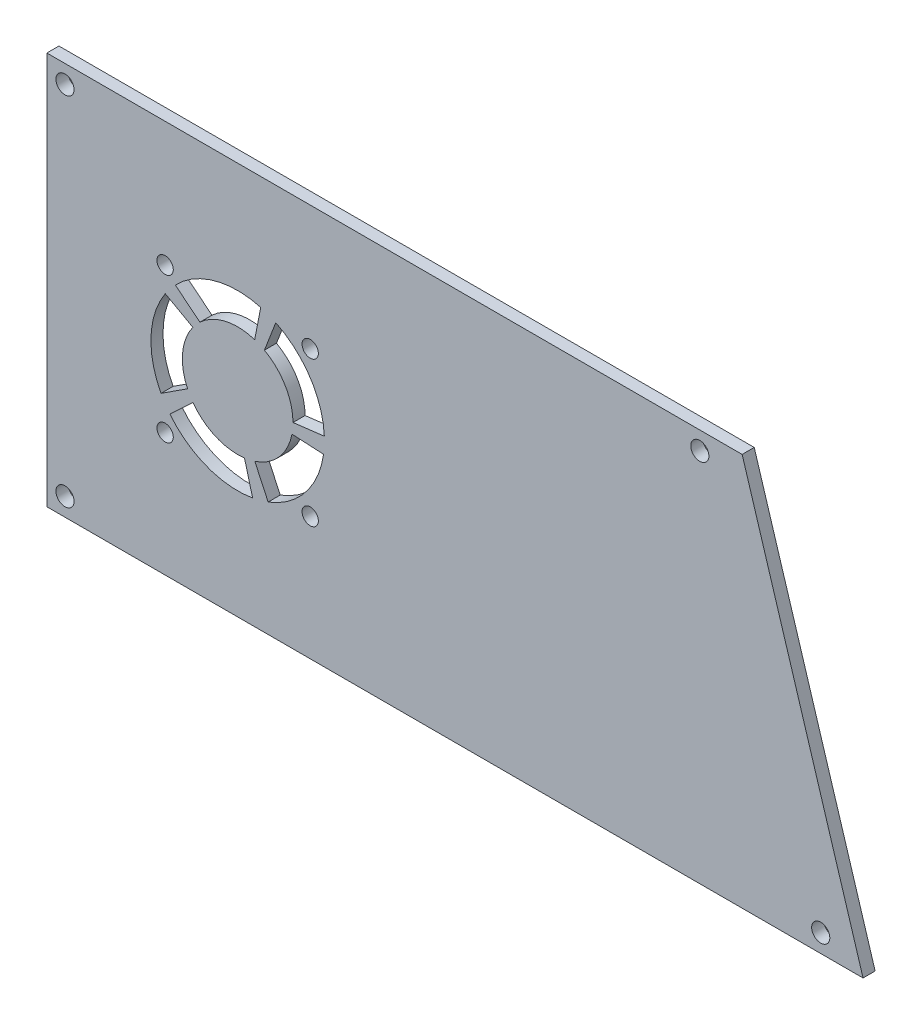
ISO-10303-21;
HEADER;
FILE_DESCRIPTION(('STEP AP214'),'2;1');
FILE_NAME('part.step','',(''),(''),'','','');
FILE_SCHEMA(('AUTOMOTIVE_DESIGN { 1 0 10303 214 1 1 1 1 }'));
ENDSEC;
DATA;
#1=APPLICATION_CONTEXT('core data for automotive mechanical design processes');
#2=APPLICATION_PROTOCOL_DEFINITION('international standard','automotive_design',2000,#1);
#3=PRODUCT_CONTEXT('',#1,'mechanical');
#4=PRODUCT('Part','Part','',(#3));
#5=PRODUCT_RELATED_PRODUCT_CATEGORY('part','',(#4));
#6=PRODUCT_DEFINITION_FORMATION('','',#4);
#7=PRODUCT_DEFINITION_CONTEXT('part definition',#1,'design');
#8=PRODUCT_DEFINITION('design','',#6,#7);
#9=PRODUCT_DEFINITION_SHAPE('','',#8);
#10=(LENGTH_UNIT() NAMED_UNIT(*) SI_UNIT(.MILLI.,.METRE.));
#11=(NAMED_UNIT(*) PLANE_ANGLE_UNIT() SI_UNIT($,.RADIAN.));
#12=(NAMED_UNIT(*) SI_UNIT($,.STERADIAN.) SOLID_ANGLE_UNIT());
#13=UNCERTAINTY_MEASURE_WITH_UNIT(LENGTH_MEASURE(1.E-05),#10,'distance_accuracy_value','');
#14=(GEOMETRIC_REPRESENTATION_CONTEXT(3) GLOBAL_UNCERTAINTY_ASSIGNED_CONTEXT((#13)) GLOBAL_UNIT_ASSIGNED_CONTEXT((#10,
#11,#12)) REPRESENTATION_CONTEXT('',''));
#15=CARTESIAN_POINT('',(0.,0.,0.));
#16=DIRECTION('',(0.,0.,1.));
#17=DIRECTION('',(1.,0.,0.));
#18=AXIS2_PLACEMENT_3D('',#15,#16,#17);
#19=CARTESIAN_POINT('',(-25.9403048802233,-0.089410627221541,2.));
#20=DIRECTION('',(0.,0.,-1.));
#21=DIRECTION('',(-1.,0.,0.));
#22=AXIS2_PLACEMENT_3D('',#19,#20,#21);
#23=CYLINDRICAL_SURFACE('',#22,14.35);
#24=CARTESIAN_POINT('',(-25.9403048802233,-0.089410627221541,2.));
#25=DIRECTION('',(0.,0.,-1.));
#26=DIRECTION('',(-1.,0.,0.));
#27=AXIS2_PLACEMENT_3D('',#24,#25,#26);
#28=CIRCLE('',#27,14.35);
#29=CARTESIAN_POINT('',(-23.4647863790737,-14.224272075091,2.));
#30=VERTEX_POINT('',#29);
#31=CARTESIAN_POINT('',(-37.1593323332284,-9.03680818230524,2.));
#32=VERTEX_POINT('',#31);
#33=EDGE_CURVE('E57',#30,#32,#28,.T.);
#34=ORIENTED_EDGE('',*,*,#33,.F.);
#35=DIRECTION('',(0.,0.,1.));
#36=VECTOR('',#35,1.);
#37=CARTESIAN_POINT('',(-23.4647863790737,-14.224272075091,0.));
#38=LINE('',#37,#36);
#39=CARTESIAN_POINT('',(-23.4647863790737,-14.224272075091,0.));
#40=VERTEX_POINT('',#39);
#41=EDGE_CURVE('E426',#40,#30,#38,.T.);
#42=ORIENTED_EDGE('',*,*,#41,.F.);
#43=CARTESIAN_POINT('',(-25.9403048802233,-0.089410627221541,0.));
#44=DIRECTION('',(0.,0.,-1.));
#45=DIRECTION('',(-1.,0.,0.));
#46=AXIS2_PLACEMENT_3D('',#43,#44,#45);
#47=CIRCLE('',#46,14.35);
#48=CARTESIAN_POINT('',(-37.1593323332284,-9.03680818230524,0.));
#49=VERTEX_POINT('',#48);
#50=EDGE_CURVE('E375',#40,#49,#47,.T.);
#51=ORIENTED_EDGE('',*,*,#50,.T.);
#52=DIRECTION('',(0.,0.,1.));
#53=VECTOR('',#52,1.);
#54=CARTESIAN_POINT('',(-37.1593323332284,-9.03680818230524,0.));
#55=LINE('',#54,#53);
#56=EDGE_CURVE('E256',#49,#32,#55,.T.);
#57=ORIENTED_EDGE('',*,*,#56,.T.);
#58=EDGE_LOOP('',(#34,#42,#51,#57));
#59=FACE_BOUND('',#58,.T.);
#60=ADVANCED_FACE('F39',(#59),#23,.F.);
#61=CARTESIAN_POINT('',(-25.9403048802233,-0.089410627221541,2.));
#62=DIRECTION('',(0.,0.,-1.));
#63=DIRECTION('',(-1.,0.,0.));
#64=AXIS2_PLACEMENT_3D('',#61,#62,#63);
#65=CYLINDRICAL_SURFACE('',#64,9.15);
#66=DIRECTION('',(0.,0.,1.));
#67=VECTOR('',#66,1.);
#68=CARTESIAN_POINT('',(-24.8128992049946,-9.16968906146915,0.));
#69=LINE('',#68,#67);
#70=CARTESIAN_POINT('',(-24.8128992049946,-9.16968906146914,0.));
#71=VERTEX_POINT('',#70);
#72=CARTESIAN_POINT('',(-24.8128992049946,-9.16968906146915,2.));
#73=VERTEX_POINT('',#72);
#74=EDGE_CURVE('E224',#71,#73,#69,.T.);
#75=ORIENTED_EDGE('',*,*,#74,.T.);
#76=CARTESIAN_POINT('',(-25.9403048802233,-0.089410627221541,2.));
#77=DIRECTION('',(0.,0.,-1.));
#78=DIRECTION('',(-1.,0.,0.));
#79=AXIS2_PLACEMENT_3D('',#76,#77,#78);
#80=CIRCLE('',#79,9.15);
#81=CARTESIAN_POINT('',(-33.3348111189585,-5.47863853901995,2.));
#82=VERTEX_POINT('',#81);
#83=EDGE_CURVE('E245',#73,#82,#80,.T.);
#84=ORIENTED_EDGE('',*,*,#83,.T.);
#85=DIRECTION('',(0.,0.,1.));
#86=VECTOR('',#85,1.);
#87=CARTESIAN_POINT('',(-33.3348111189585,-5.47863853901995,0.));
#88=LINE('',#87,#86);
#89=CARTESIAN_POINT('',(-33.3348111189585,-5.47863853901995,0.));
#90=VERTEX_POINT('',#89);
#91=EDGE_CURVE('E271',#90,#82,#88,.T.);
#92=ORIENTED_EDGE('',*,*,#91,.F.);
#93=CARTESIAN_POINT('',(-25.9403048802233,-0.089410627221541,0.));
#94=DIRECTION('',(0.,0.,-1.));
#95=DIRECTION('',(-1.,0.,0.));
#96=AXIS2_PLACEMENT_3D('',#93,#94,#95);
#97=CIRCLE('',#96,9.15);
#98=EDGE_CURVE('E233',#71,#90,#97,.T.);
#99=ORIENTED_EDGE('',*,*,#98,.F.);
#100=EDGE_LOOP('',(#75,#84,#92,#99));
#101=FACE_BOUND('',#100,.T.);
#102=ADVANCED_FACE('F556',(#101),#65,.T.);
#103=CARTESIAN_POINT('',(-11.7322755065531,-2.1029650260209,0.));
#104=VERTEX_POINT('',#103);
#105=CARTESIAN_POINT('',(-20.8976942749154,-13.524237692846,0.));
#106=VERTEX_POINT('',#105);
#107=EDGE_CURVE('E388',#104,#106,#47,.T.);
#108=ORIENTED_EDGE('',*,*,#107,.T.);
#109=DIRECTION('',(0.,0.,1.));
#110=VECTOR('',#109,1.);
#111=CARTESIAN_POINT('',(-20.8976942749154,-13.524237692846,0.));
#112=LINE('',#111,#110);
#113=CARTESIAN_POINT('',(-20.8976942749154,-13.524237692846,2.));
#114=VERTEX_POINT('',#113);
#115=EDGE_CURVE('E65',#106,#114,#112,.T.);
#116=ORIENTED_EDGE('',*,*,#115,.T.);
#117=CARTESIAN_POINT('',(-11.7322755065531,-2.1029650260209,2.));
#118=VERTEX_POINT('',#117);
#119=EDGE_CURVE('E504',#118,#114,#28,.T.);
#120=ORIENTED_EDGE('',*,*,#119,.F.);
#121=DIRECTION('',(0.,0.,1.));
#122=VECTOR('',#121,1.);
#123=CARTESIAN_POINT('',(-11.7322755065531,-2.1029650260209,0.));
#124=LINE('',#123,#122);
#125=EDGE_CURVE('E428',#104,#118,#124,.T.);
#126=ORIENTED_EDGE('',*,*,#125,.F.);
#127=EDGE_LOOP('',(#108,#116,#120,#126));
#128=FACE_BOUND('',#127,.T.);
#129=ADVANCED_FACE('F558',(#128),#23,.F.);
#130=DIRECTION('',(0.,0.,1.));
#131=VECTOR('',#130,1.);
#132=CARTESIAN_POINT('',(-23.0998726496885,-8.78736698166132,0.));
#133=LINE('',#132,#131);
#134=CARTESIAN_POINT('',(-23.0998726496885,-8.78736698166132,0.));
#135=VERTEX_POINT('',#134);
#136=CARTESIAN_POINT('',(-23.0998726496885,-8.78736698166132,2.));
#137=VERTEX_POINT('',#136);
#138=EDGE_CURVE('E207',#135,#137,#133,.T.);
#139=ORIENTED_EDGE('',*,*,#138,.F.);
#140=CARTESIAN_POINT('',(-16.9560593923573,-1.82314446312594,0.));
#141=VERTEX_POINT('',#140);
#142=EDGE_CURVE('E220',#141,#135,#97,.T.);
#143=ORIENTED_EDGE('',*,*,#142,.F.);
#144=DIRECTION('',(0.,0.,1.));
#145=VECTOR('',#144,1.);
#146=CARTESIAN_POINT('',(-16.9560593923573,-1.82314446312594,0.));
#147=LINE('',#146,#145);
#148=CARTESIAN_POINT('',(-16.9560593923573,-1.82314446312594,2.));
#149=VERTEX_POINT('',#148);
#150=EDGE_CURVE('E433',#141,#149,#147,.T.);
#151=ORIENTED_EDGE('',*,*,#150,.T.);
#152=EDGE_CURVE('E222',#149,#137,#80,.T.);
#153=ORIENTED_EDGE('',*,*,#152,.T.);
#154=EDGE_LOOP('',(#139,#143,#151,#153));
#155=FACE_BOUND('',#154,.T.);
#156=ADVANCED_FACE('F218',(#155),#65,.T.);
#157=CARTESIAN_POINT('',(-19.6347783152879,12.801005763993,0.));
#158=VERTEX_POINT('',#157);
#159=CARTESIAN_POINT('',(-11.6047726811072,0.554807168329131,0.));
#160=VERTEX_POINT('',#159);
#161=EDGE_CURVE('E386',#158,#160,#47,.T.);
#162=ORIENTED_EDGE('',*,*,#161,.T.);
#163=DIRECTION('',(0.,0.,1.));
#164=VECTOR('',#163,1.);
#165=CARTESIAN_POINT('',(-11.6047726811072,0.554807168329131,0.));
#166=LINE('',#165,#164);
#167=CARTESIAN_POINT('',(-11.6047726811072,0.554807168329131,2.));
#168=VERTEX_POINT('',#167);
#169=EDGE_CURVE('E397',#160,#168,#166,.T.);
#170=ORIENTED_EDGE('',*,*,#169,.T.);
#171=CARTESIAN_POINT('',(-19.6347783152879,12.801005763993,2.));
#172=VERTEX_POINT('',#171);
#173=EDGE_CURVE('E502',#172,#168,#28,.T.);
#174=ORIENTED_EDGE('',*,*,#173,.F.);
#175=DIRECTION('',(0.,0.,1.));
#176=VECTOR('',#175,1.);
#177=CARTESIAN_POINT('',(-19.6347783152879,12.801005763993,0.));
#178=LINE('',#177,#176);
#179=EDGE_CURVE('E400',#158,#172,#178,.T.);
#180=ORIENTED_EDGE('',*,*,#179,.F.);
#181=EDGE_LOOP('',(#162,#170,#174,#180));
#182=FACE_BOUND('',#181,.T.);
#183=ADVANCED_FACE('F396',(#182),#23,.F.);
#184=DIRECTION('',(0.,0.,1.));
#185=VECTOR('',#184,1.);
#186=CARTESIAN_POINT('',(-16.7903149802769,-0.0758153751301005,0.));
#187=LINE('',#186,#185);
#188=CARTESIAN_POINT('',(-16.7903149802769,-0.0758153751301005,0.));
#189=VERTEX_POINT('',#188);
#190=CARTESIAN_POINT('',(-16.7903149802769,-0.0758153751301005,2.));
#191=VERTEX_POINT('',#190);
#192=EDGE_CURVE('E411',#189,#191,#187,.T.);
#193=ORIENTED_EDGE('',*,*,#192,.F.);
#194=CARTESIAN_POINT('',(-21.5151414806781,7.91936136899142,0.));
#195=VERTEX_POINT('',#194);
#196=EDGE_CURVE('E232',#195,#189,#97,.T.);
#197=ORIENTED_EDGE('',*,*,#196,.F.);
#198=DIRECTION('',(0.,0.,1.));
#199=VECTOR('',#198,1.);
#200=CARTESIAN_POINT('',(-21.5151414806781,7.91936136899143,0.));
#201=LINE('',#200,#199);
#202=CARTESIAN_POINT('',(-21.5151414806781,7.91936136899143,2.));
#203=VERTEX_POINT('',#202);
#204=EDGE_CURVE('E455',#195,#203,#201,.T.);
#205=ORIENTED_EDGE('',*,*,#204,.T.);
#206=EDGE_CURVE('E520',#203,#191,#80,.T.);
#207=ORIENTED_EDGE('',*,*,#206,.T.);
#208=EDGE_LOOP('',(#193,#197,#205,#207));
#209=FACE_BOUND('',#208,.T.);
#210=ADVANCED_FACE('F519',(#209),#65,.T.);
#211=CARTESIAN_POINT('',(-36.2513045197981,9.89085923048711,0.));
#212=VERTEX_POINT('',#211);
#213=CARTESIAN_POINT('',(-22.123069339659,13.7435649322108,0.));
#214=VERTEX_POINT('',#213);
#215=EDGE_CURVE('E380',#212,#214,#47,.T.);
#216=ORIENTED_EDGE('',*,*,#215,.T.);
#217=DIRECTION('',(0.,0.,1.));
#218=VECTOR('',#217,1.);
#219=CARTESIAN_POINT('',(-22.123069339659,13.7435649322108,0.));
#220=LINE('',#219,#218);
#221=CARTESIAN_POINT('',(-22.123069339659,13.7435649322108,2.));
#222=VERTEX_POINT('',#221);
#223=EDGE_CURVE('E445',#214,#222,#220,.T.);
#224=ORIENTED_EDGE('',*,*,#223,.T.);
#225=CARTESIAN_POINT('',(-36.2513045197981,9.89085923048711,2.));
#226=VERTEX_POINT('',#225);
#227=EDGE_CURVE('E499',#226,#222,#28,.T.);
#228=ORIENTED_EDGE('',*,*,#227,.F.);
#229=DIRECTION('',(0.,0.,1.));
#230=VECTOR('',#229,1.);
#231=CARTESIAN_POINT('',(-36.2513045197981,9.89085923048711,0.));
#232=LINE('',#231,#230);
#233=EDGE_CURVE('E239',#212,#226,#232,.T.);
#234=ORIENTED_EDGE('',*,*,#233,.F.);
#235=EDGE_LOOP('',(#216,#224,#228,#234));
#236=FACE_BOUND('',#235,.T.);
#237=ADVANCED_FACE('F566',(#236),#23,.F.);
#238=DIRECTION('',(0.,0.,1.));
#239=VECTOR('',#238,1.);
#240=CARTESIAN_POINT('',(-23.125732355873,8.61694805509637,0.));
#241=LINE('',#240,#239);
#242=CARTESIAN_POINT('',(-23.125732355873,8.61694805509637,0.));
#243=VERTEX_POINT('',#242);
#244=CARTESIAN_POINT('',(-23.125732355873,8.61694805509637,2.));
#245=VERTEX_POINT('',#244);
#246=EDGE_CURVE('E459',#243,#245,#241,.T.);
#247=ORIENTED_EDGE('',*,*,#246,.F.);
#248=CARTESIAN_POINT('',(-32.1896489813983,6.59401651049076,0.));
#249=VERTEX_POINT('',#248);
#250=EDGE_CURVE('E238',#249,#243,#97,.T.);
#251=ORIENTED_EDGE('',*,*,#250,.F.);
#252=DIRECTION('',(0.,0.,1.));
#253=VECTOR('',#252,1.);
#254=CARTESIAN_POINT('',(-32.1896489813983,6.59401651049077,0.));
#255=LINE('',#254,#253);
#256=CARTESIAN_POINT('',(-32.1896489813983,6.59401651049077,2.));
#257=VERTEX_POINT('',#256);
#258=EDGE_CURVE('E481',#249,#257,#255,.T.);
#259=ORIENTED_EDGE('',*,*,#258,.T.);
#260=EDGE_CURVE('E522',#257,#245,#80,.T.);
#261=ORIENTED_EDGE('',*,*,#260,.T.);
#262=EDGE_LOOP('',(#247,#251,#259,#261));
#263=FACE_BOUND('',#262,.T.);
#264=ADVANCED_FACE('F576',(#263),#65,.T.);
#265=CARTESIAN_POINT('',(-57.5,32.5,2.));
#266=DIRECTION('',(0.,-1.,0.));
#267=DIRECTION('',(0.,0.,-1.));
#268=AXIS2_PLACEMENT_3D('',#265,#266,#267);
#269=PLANE('',#268);
#270=DIRECTION('',(-1.,0.,0.));
#271=VECTOR('',#270,1.);
#272=CARTESIAN_POINT('',(-57.5,32.5,0.));
#273=LINE('',#272,#271);
#274=CARTESIAN_POINT('',(57.5,32.5,0.));
#275=VERTEX_POINT('',#274);
#276=CARTESIAN_POINT('',(-57.5,32.5,0.));
#277=VERTEX_POINT('',#276);
#278=EDGE_CURVE('E267',#275,#277,#273,.T.);
#279=ORIENTED_EDGE('',*,*,#278,.T.);
#280=DIRECTION('',(0.,0.,-1.));
#281=VECTOR('',#280,1.);
#282=CARTESIAN_POINT('',(-57.5,32.5,2.));
#283=LINE('',#282,#281);
#284=CARTESIAN_POINT('',(-57.5,32.5,2.));
#285=VERTEX_POINT('',#284);
#286=EDGE_CURVE('E282',#285,#277,#283,.T.);
#287=ORIENTED_EDGE('',*,*,#286,.F.);
#288=DIRECTION('',(-1.,0.,0.));
#289=VECTOR('',#288,1.);
#290=CARTESIAN_POINT('',(-57.5,32.5,2.));
#291=LINE('',#290,#289);
#292=CARTESIAN_POINT('',(57.5,32.5,2.));
#293=VERTEX_POINT('',#292);
#294=EDGE_CURVE('E301',#293,#285,#291,.T.);
#295=ORIENTED_EDGE('',*,*,#294,.F.);
#296=DIRECTION('',(0.,0.,-1.));
#297=VECTOR('',#296,1.);
#298=CARTESIAN_POINT('',(57.5,32.5,2.));
#299=LINE('',#298,#297);
#300=EDGE_CURVE('E277',#293,#275,#299,.T.);
#301=ORIENTED_EDGE('',*,*,#300,.T.);
#302=EDGE_LOOP('',(#279,#287,#295,#301));
#303=FACE_BOUND('',#302,.T.);
#304=ADVANCED_FACE('F582',(#303),#269,.F.);
#305=CARTESIAN_POINT('',(-57.5,-32.5,2.));
#306=DIRECTION('',(1.,0.,0.));
#307=DIRECTION('',(0.,0.,-1.));
#308=AXIS2_PLACEMENT_3D('',#305,#306,#307);
#309=PLANE('',#308);
#310=DIRECTION('',(0.,-1.,0.));
#311=VECTOR('',#310,1.);
#312=CARTESIAN_POINT('',(-57.5,-32.5,0.));
#313=LINE('',#312,#311);
#314=CARTESIAN_POINT('',(-57.5,-32.5,0.));
#315=VERTEX_POINT('',#314);
#316=EDGE_CURVE('E281',#277,#315,#313,.T.);
#317=ORIENTED_EDGE('',*,*,#316,.T.);
#318=DIRECTION('',(0.,0.,-1.));
#319=VECTOR('',#318,1.);
#320=CARTESIAN_POINT('',(-57.5,-32.5,2.));
#321=LINE('',#320,#319);
#322=CARTESIAN_POINT('',(-57.5,-32.5,2.));
#323=VERTEX_POINT('',#322);
#324=EDGE_CURVE('E287',#323,#315,#321,.T.);
#325=ORIENTED_EDGE('',*,*,#324,.F.);
#326=DIRECTION('',(0.,-1.,0.));
#327=VECTOR('',#326,1.);
#328=CARTESIAN_POINT('',(-57.5,-32.5,2.));
#329=LINE('',#328,#327);
#330=EDGE_CURVE('E303',#285,#323,#329,.T.);
#331=ORIENTED_EDGE('',*,*,#330,.F.);
#332=ORIENTED_EDGE('',*,*,#286,.T.);
#333=EDGE_LOOP('',(#317,#325,#331,#332));
#334=FACE_BOUND('',#333,.T.);
#335=ADVANCED_FACE('F643',(#334),#309,.F.);
#336=CARTESIAN_POINT('',(-57.5,-32.5,2.));
#337=DIRECTION('',(0.,1.,0.));
#338=DIRECTION('',(0.,0.,1.));
#339=AXIS2_PLACEMENT_3D('',#336,#337,#338);
#340=PLANE('',#339);
#341=DIRECTION('',(1.,0.,0.));
#342=VECTOR('',#341,1.);
#343=CARTESIAN_POINT('',(-57.5,-32.5,0.));
#344=LINE('',#343,#342);
#345=CARTESIAN_POINT('',(77.5,-32.5,0.));
#346=VERTEX_POINT('',#345);
#347=EDGE_CURVE('E286',#315,#346,#344,.T.);
#348=ORIENTED_EDGE('',*,*,#347,.T.);
#349=DIRECTION('',(0.,0.,-1.));
#350=VECTOR('',#349,1.);
#351=CARTESIAN_POINT('',(77.5,-32.5,2.));
#352=LINE('',#351,#350);
#353=CARTESIAN_POINT('',(77.5,-32.5,2.));
#354=VERTEX_POINT('',#353);
#355=EDGE_CURVE('E309',#354,#346,#352,.T.);
#356=ORIENTED_EDGE('',*,*,#355,.F.);
#357=DIRECTION('',(1.,0.,0.));
#358=VECTOR('',#357,1.);
#359=CARTESIAN_POINT('',(-57.5,-32.5,2.));
#360=LINE('',#359,#358);
#361=EDGE_CURVE('E298',#323,#354,#360,.T.);
#362=ORIENTED_EDGE('',*,*,#361,.F.);
#363=ORIENTED_EDGE('',*,*,#324,.T.);
#364=EDGE_LOOP('',(#348,#356,#362,#363));
#365=FACE_BOUND('',#364,.T.);
#366=ADVANCED_FACE('F637',(#365),#340,.F.);
#367=CARTESIAN_POINT('',(0.,0.,2.));
#368=DIRECTION('',(0.,0.,-1.));
#369=DIRECTION('',(-1.,0.,0.));
#370=AXIS2_PLACEMENT_3D('',#367,#368,#369);
#371=PLANE('',#370);
#372=ORIENTED_EDGE('',*,*,#119,.T.);
#373=DIRECTION('',(-0.421570633889257,0.906795567171681,0.));
#374=VECTOR('',#373,1.);
#375=CARTESIAN_POINT('',(-20.8976942749154,-13.524237692846,2.));
#376=LINE('',#375,#374);
#377=EDGE_CURVE('E621',#114,#137,#376,.T.);
#378=ORIENTED_EDGE('',*,*,#377,.T.);
#379=ORIENTED_EDGE('',*,*,#152,.F.);
#380=DIRECTION('',(0.998568387566009,-0.0534899556348738,0.));
#381=VECTOR('',#380,1.);
#382=CARTESIAN_POINT('',(-11.7322755065531,-2.1029650260209,2.));
#383=LINE('',#382,#381);
#384=EDGE_CURVE('E416',#149,#118,#383,.T.);
#385=ORIENTED_EDGE('',*,*,#384,.T.);
#386=EDGE_LOOP('',(#372,#378,#379,#385));
#387=FACE_BOUND('',#386,.T.);
#388=ORIENTED_EDGE('',*,*,#173,.T.);
#389=DIRECTION('',(-0.992686323307386,-0.12072225775914,0.));
#390=VECTOR('',#389,1.);
#391=CARTESIAN_POINT('',(-11.6047726811072,0.554807168329131,2.));
#392=LINE('',#391,#390);
#393=EDGE_CURVE('E409',#168,#191,#392,.T.);
#394=ORIENTED_EDGE('',*,*,#393,.T.);
#395=ORIENTED_EDGE('',*,*,#206,.F.);
#396=DIRECTION('',(0.359446572666368,0.933165666641461,0.));
#397=VECTOR('',#396,1.);
#398=CARTESIAN_POINT('',(-19.6347783152879,12.801005763993,2.));
#399=LINE('',#398,#397);
#400=EDGE_CURVE('E442',#203,#172,#399,.T.);
#401=ORIENTED_EDGE('',*,*,#400,.T.);
#402=EDGE_LOOP('',(#388,#394,#395,#401));
#403=FACE_BOUND('',#402,.T.);
#404=ORIENTED_EDGE('',*,*,#227,.T.);
#405=DIRECTION('',(-0.191943254081869,-0.981406025665455,0.));
#406=VECTOR('',#405,1.);
#407=CARTESIAN_POINT('',(-22.123069339659,13.7435649322108,2.));
#408=LINE('',#407,#406);
#409=EDGE_CURVE('E432',#222,#245,#408,.T.);
#410=ORIENTED_EDGE('',*,*,#409,.T.);
#411=ORIENTED_EDGE('',*,*,#260,.F.);
#412=DIRECTION('',(-0.776418188518537,0.630218054753745,0.));
#413=VECTOR('',#412,1.);
#414=CARTESIAN_POINT('',(-36.2513045197981,9.89085923048711,2.));
#415=LINE('',#414,#413);
#416=EDGE_CURVE('E469',#257,#226,#415,.T.);
#417=ORIENTED_EDGE('',*,*,#416,.T.);
#418=EDGE_LOOP('',(#404,#410,#411,#417));
#419=FACE_BOUND('',#418,.T.);
#420=CARTESIAN_POINT('',(-38.6183796804038,-6.81168102947614,2.));
#421=VERTEX_POINT('',#420);
#422=CARTESIAN_POINT('',(-37.9166557722066,7.81562063850347,2.));
#423=VERTEX_POINT('',#422);
#424=EDGE_CURVE('E43',#421,#423,#28,.T.);
#425=ORIENTED_EDGE('',*,*,#424,.T.);
#426=DIRECTION('',(0.874058868373535,-0.485820022866057,0.));
#427=VECTOR('',#426,1.);
#428=CARTESIAN_POINT('',(-37.9166557722066,7.81562063850347,2.));
#429=LINE('',#428,#427);
#430=CARTESIAN_POINT('',(-33.3507932963196,5.27781970460719,2.));
#431=VERTEX_POINT('',#430);
#432=EDGE_CURVE('E454',#423,#431,#429,.T.);
#433=ORIENTED_EDGE('',*,*,#432,.T.);
#434=CARTESIAN_POINT('',(-34.2277753416884,-3.96759749099492,2.));
#435=VERTEX_POINT('',#434);
#436=EDGE_CURVE('E246',#435,#431,#80,.T.);
#437=ORIENTED_EDGE('',*,*,#436,.F.);
#438=DIRECTION('',(-0.839299402654443,-0.543669488479807,0.));
#439=VECTOR('',#438,1.);
#440=CARTESIAN_POINT('',(-38.6183796804038,-6.81168102947615,2.));
#441=LINE('',#440,#439);
#442=EDGE_CURVE('E253',#435,#421,#441,.T.);
#443=ORIENTED_EDGE('',*,*,#442,.T.);
#444=EDGE_LOOP('',(#425,#433,#437,#443));
#445=FACE_BOUND('',#444,.T.);
#446=CARTESIAN_POINT('',(-37.9403048802233,11.9105893727785,2.));
#447=DIRECTION('',(0.,0.,-1.));
#448=DIRECTION('',(-1.,0.,0.));
#449=AXIS2_PLACEMENT_3D('',#446,#447,#448);
#450=CIRCLE('',#449,1.35);
#451=CARTESIAN_POINT('',(-39.2903048802233,11.9105893727785,2.));
#452=VERTEX_POINT('',#451);
#453=EDGE_CURVE('E291',#452,#452,#450,.T.);
#454=ORIENTED_EDGE('',*,*,#453,.T.);
#455=EDGE_LOOP('',(#454));
#456=FACE_BOUND('',#455,.T.);
#457=CARTESIAN_POINT('',(-37.9403048802233,-12.0894106272215,2.));
#458=DIRECTION('',(0.,0.,-1.));
#459=DIRECTION('',(-1.,0.,0.));
#460=AXIS2_PLACEMENT_3D('',#457,#458,#459);
#461=CIRCLE('',#460,1.35);
#462=CARTESIAN_POINT('',(-39.2903048802233,-12.0894106272215,2.));
#463=VERTEX_POINT('',#462);
#464=EDGE_CURVE('E365',#463,#463,#461,.T.);
#465=ORIENTED_EDGE('',*,*,#464,.T.);
#466=EDGE_LOOP('',(#465));
#467=FACE_BOUND('',#466,.T.);
#468=DIRECTION('',(0.257702630940598,-0.966224277280536,0.));
#469=VECTOR('',#468,1.);
#470=CARTESIAN_POINT('',(-23.4647863790737,-14.224272075091,2.));
#471=LINE('',#470,#469);
#472=EDGE_CURVE('E213',#73,#30,#471,.T.);
#473=ORIENTED_EDGE('',*,*,#472,.T.);
#474=ORIENTED_EDGE('',*,*,#33,.T.);
#475=DIRECTION('',(0.732141342904979,0.681152739118983,0.));
#476=VECTOR('',#475,1.);
#477=CARTESIAN_POINT('',(-37.1593323332284,-9.03680818230524,2.));
#478=LINE('',#477,#476);
#479=EDGE_CURVE('E257',#32,#82,#478,.T.);
#480=ORIENTED_EDGE('',*,*,#479,.T.);
#481=ORIENTED_EDGE('',*,*,#83,.F.);
#482=EDGE_LOOP('',(#473,#474,#480,#481));
#483=FACE_BOUND('',#482,.T.);
#484=CARTESIAN_POINT('',(-13.9403048802233,-12.0894106272215,2.));
#485=DIRECTION('',(0.,0.,-1.));
#486=DIRECTION('',(-1.,0.,0.));
#487=AXIS2_PLACEMENT_3D('',#484,#485,#486);
#488=CIRCLE('',#487,1.35);
#489=CARTESIAN_POINT('',(-15.2903048802233,-12.0894106272215,2.));
#490=VERTEX_POINT('',#489);
#491=EDGE_CURVE('E360',#490,#490,#488,.T.);
#492=ORIENTED_EDGE('',*,*,#491,.T.);
#493=EDGE_LOOP('',(#492));
#494=FACE_BOUND('',#493,.T.);
#495=CARTESIAN_POINT('',(-13.9403048802233,11.9105893727785,2.));
#496=DIRECTION('',(0.,0.,-1.));
#497=DIRECTION('',(-1.,0.,0.));
#498=AXIS2_PLACEMENT_3D('',#495,#496,#497);
#499=CIRCLE('',#498,1.35);
#500=CARTESIAN_POINT('',(-15.2903048802233,11.9105893727785,2.));
#501=VERTEX_POINT('',#500);
#502=EDGE_CURVE('E340',#501,#501,#499,.T.);
#503=ORIENTED_EDGE('',*,*,#502,.T.);
#504=EDGE_LOOP('',(#503));
#505=FACE_BOUND('',#504,.T.);
#506=CARTESIAN_POINT('',(-54.5,29.5,2.));
#507=DIRECTION('',(0.,0.,-1.));
#508=DIRECTION('',(-1.,0.,0.));
#509=AXIS2_PLACEMENT_3D('',#506,#507,#508);
#510=CIRCLE('',#509,1.5);
#511=CARTESIAN_POINT('',(-56.,29.5,2.));
#512=VERTEX_POINT('',#511);
#513=EDGE_CURVE('E335',#512,#512,#510,.T.);
#514=ORIENTED_EDGE('',*,*,#513,.T.);
#515=EDGE_LOOP('',(#514));
#516=FACE_BOUND('',#515,.T.);
#517=CARTESIAN_POINT('',(-54.5,-29.5,2.));
#518=DIRECTION('',(0.,0.,-1.));
#519=DIRECTION('',(-1.,0.,0.));
#520=AXIS2_PLACEMENT_3D('',#517,#518,#519);
#521=CIRCLE('',#520,1.5);
#522=CARTESIAN_POINT('',(-56.,-29.5,2.));
#523=VERTEX_POINT('',#522);
#524=EDGE_CURVE('E339',#523,#523,#521,.T.);
#525=ORIENTED_EDGE('',*,*,#524,.T.);
#526=EDGE_LOOP('',(#525));
#527=FACE_BOUND('',#526,.T.);
#528=CARTESIAN_POINT('',(70.5,-29.5,2.));
#529=DIRECTION('',(0.,0.,-1.));
#530=DIRECTION('',(-1.,0.,0.));
#531=AXIS2_PLACEMENT_3D('',#528,#529,#530);
#532=CIRCLE('',#531,1.5);
#533=CARTESIAN_POINT('',(69.,-29.5,2.));
#534=VERTEX_POINT('',#533);
#535=EDGE_CURVE('E328',#534,#534,#532,.T.);
#536=ORIENTED_EDGE('',*,*,#535,.T.);
#537=EDGE_LOOP('',(#536));
#538=FACE_BOUND('',#537,.T.);
#539=CARTESIAN_POINT('',(50.5,29.5,2.));
#540=DIRECTION('',(0.,0.,-1.));
#541=DIRECTION('',(-1.,0.,0.));
#542=AXIS2_PLACEMENT_3D('',#539,#540,#541);
#543=CIRCLE('',#542,1.5);
#544=CARTESIAN_POINT('',(49.,29.5,2.));
#545=VERTEX_POINT('',#544);
#546=EDGE_CURVE('E302',#545,#545,#543,.T.);
#547=ORIENTED_EDGE('',*,*,#546,.T.);
#548=EDGE_LOOP('',(#547));
#549=FACE_BOUND('',#548,.T.);
#550=ORIENTED_EDGE('',*,*,#361,.T.);
#551=DIRECTION('',(0.294085848837523,-0.95577900872195,0.));
#552=VECTOR('',#551,1.);
#553=CARTESIAN_POINT('',(57.5,32.5,2.));
#554=LINE('',#553,#552);
#555=EDGE_CURVE('E314',#293,#354,#554,.T.);
#556=ORIENTED_EDGE('',*,*,#555,.F.);
#557=ORIENTED_EDGE('',*,*,#294,.T.);
#558=ORIENTED_EDGE('',*,*,#330,.T.);
#559=EDGE_LOOP('',(#550,#556,#557,#558));
#560=FACE_BOUND('',#559,.T.);
#561=ADVANCED_FACE('F41',(#387,#403,#419,#445,#456,#467,#483,#494,#505,#516,#527,#538,#549,
#560),#371,.F.);
#562=CARTESIAN_POINT('',(0.,0.,0.));
#563=DIRECTION('',(0.,0.,-1.));
#564=DIRECTION('',(-1.,0.,0.));
#565=AXIS2_PLACEMENT_3D('',#562,#563,#564);
#566=PLANE('',#565);
#567=DIRECTION('',(-0.421570633889257,0.906795567171681,0.));
#568=VECTOR('',#567,1.);
#569=CARTESIAN_POINT('',(-20.8976942749154,-13.524237692846,0.));
#570=LINE('',#569,#568);
#571=EDGE_CURVE('E203',#106,#135,#570,.T.);
#572=ORIENTED_EDGE('',*,*,#571,.F.);
#573=ORIENTED_EDGE('',*,*,#107,.F.);
#574=DIRECTION('',(0.998568387566009,-0.0534899556348738,0.));
#575=VECTOR('',#574,1.);
#576=CARTESIAN_POINT('',(-11.7322755065531,-2.1029650260209,0.));
#577=LINE('',#576,#575);
#578=EDGE_CURVE('E229',#141,#104,#577,.T.);
#579=ORIENTED_EDGE('',*,*,#578,.F.);
#580=ORIENTED_EDGE('',*,*,#142,.T.);
#581=EDGE_LOOP('',(#572,#573,#579,#580));
#582=FACE_BOUND('',#581,.T.);
#583=DIRECTION('',(-0.992686323307386,-0.12072225775914,0.));
#584=VECTOR('',#583,1.);
#585=CARTESIAN_POINT('',(-11.6047726811072,0.554807168329131,0.));
#586=LINE('',#585,#584);
#587=EDGE_CURVE('E406',#160,#189,#586,.T.);
#588=ORIENTED_EDGE('',*,*,#587,.F.);
#589=ORIENTED_EDGE('',*,*,#161,.F.);
#590=DIRECTION('',(0.359446572666368,0.933165666641461,0.));
#591=VECTOR('',#590,1.);
#592=CARTESIAN_POINT('',(-19.6347783152879,12.801005763993,0.));
#593=LINE('',#592,#591);
#594=EDGE_CURVE('E441',#195,#158,#593,.T.);
#595=ORIENTED_EDGE('',*,*,#594,.F.);
#596=ORIENTED_EDGE('',*,*,#196,.T.);
#597=EDGE_LOOP('',(#588,#589,#595,#596));
#598=FACE_BOUND('',#597,.T.);
#599=DIRECTION('',(-0.191943254081869,-0.981406025665455,0.));
#600=VECTOR('',#599,1.);
#601=CARTESIAN_POINT('',(-22.123069339659,13.7435649322108,0.));
#602=LINE('',#601,#600);
#603=EDGE_CURVE('E438',#214,#243,#602,.T.);
#604=ORIENTED_EDGE('',*,*,#603,.F.);
#605=ORIENTED_EDGE('',*,*,#215,.F.);
#606=DIRECTION('',(-0.776418188518537,0.630218054753745,0.));
#607=VECTOR('',#606,1.);
#608=CARTESIAN_POINT('',(-36.2513045197981,9.89085923048711,0.));
#609=LINE('',#608,#607);
#610=EDGE_CURVE('E468',#249,#212,#609,.T.);
#611=ORIENTED_EDGE('',*,*,#610,.F.);
#612=ORIENTED_EDGE('',*,*,#250,.T.);
#613=EDGE_LOOP('',(#604,#605,#611,#612));
#614=FACE_BOUND('',#613,.T.);
#615=DIRECTION('',(0.874058868373535,-0.485820022866057,0.));
#616=VECTOR('',#615,1.);
#617=CARTESIAN_POINT('',(-37.9166557722066,7.81562063850347,0.));
#618=LINE('',#617,#616);
#619=CARTESIAN_POINT('',(-37.9166557722066,7.81562063850347,0.));
#620=VERTEX_POINT('',#619);
#621=CARTESIAN_POINT('',(-33.3507932963196,5.27781970460719,0.));
#622=VERTEX_POINT('',#621);
#623=EDGE_CURVE('E464',#620,#622,#618,.T.);
#624=ORIENTED_EDGE('',*,*,#623,.F.);
#625=CARTESIAN_POINT('',(-38.6183796804038,-6.81168102947615,0.));
#626=VERTEX_POINT('',#625);
#627=EDGE_CURVE('E364',#626,#620,#47,.T.);
#628=ORIENTED_EDGE('',*,*,#627,.F.);
#629=DIRECTION('',(-0.839299402654443,-0.543669488479807,0.));
#630=VECTOR('',#629,1.);
#631=CARTESIAN_POINT('',(-38.6183796804038,-6.81168102947615,0.));
#632=LINE('',#631,#630);
#633=CARTESIAN_POINT('',(-34.2277753416884,-3.96759749099492,0.));
#634=VERTEX_POINT('',#633);
#635=EDGE_CURVE('E252',#634,#626,#632,.T.);
#636=ORIENTED_EDGE('',*,*,#635,.F.);
#637=EDGE_CURVE('E240',#634,#622,#97,.T.);
#638=ORIENTED_EDGE('',*,*,#637,.T.);
#639=EDGE_LOOP('',(#624,#628,#636,#638));
#640=FACE_BOUND('',#639,.T.);
#641=CARTESIAN_POINT('',(-37.9403048802233,11.9105893727785,0.));
#642=DIRECTION('',(0.,0.,-1.));
#643=DIRECTION('',(-1.,0.,0.));
#644=AXIS2_PLACEMENT_3D('',#641,#642,#643);
#645=CIRCLE('',#644,1.35);
#646=CARTESIAN_POINT('',(-39.2903048802233,11.9105893727785,0.));
#647=VERTEX_POINT('',#646);
#648=EDGE_CURVE('E11',#647,#647,#645,.T.);
#649=ORIENTED_EDGE('',*,*,#648,.F.);
#650=EDGE_LOOP('',(#649));
#651=FACE_BOUND('',#650,.T.);
#652=CARTESIAN_POINT('',(-37.9403048802233,-12.0894106272215,0.));
#653=DIRECTION('',(0.,0.,-1.));
#654=DIRECTION('',(-1.,0.,0.));
#655=AXIS2_PLACEMENT_3D('',#652,#653,#654);
#656=CIRCLE('',#655,1.35);
#657=CARTESIAN_POINT('',(-39.2903048802233,-12.0894106272215,0.));
#658=VERTEX_POINT('',#657);
#659=EDGE_CURVE('E49',#658,#658,#656,.T.);
#660=ORIENTED_EDGE('',*,*,#659,.F.);
#661=EDGE_LOOP('',(#660));
#662=FACE_BOUND('',#661,.T.);
#663=ORIENTED_EDGE('',*,*,#50,.F.);
#664=DIRECTION('',(0.257702630940598,-0.966224277280536,0.));
#665=VECTOR('',#664,1.);
#666=CARTESIAN_POINT('',(-23.4647863790737,-14.224272075091,0.));
#667=LINE('',#666,#665);
#668=EDGE_CURVE('E212',#71,#40,#667,.T.);
#669=ORIENTED_EDGE('',*,*,#668,.F.);
#670=ORIENTED_EDGE('',*,*,#98,.T.);
#671=DIRECTION('',(0.732141342904979,0.681152739118983,0.));
#672=VECTOR('',#671,1.);
#673=CARTESIAN_POINT('',(-37.1593323332284,-9.03680818230524,0.));
#674=LINE('',#673,#672);
#675=EDGE_CURVE('E248',#49,#90,#674,.T.);
#676=ORIENTED_EDGE('',*,*,#675,.F.);
#677=EDGE_LOOP('',(#663,#669,#670,#676));
#678=FACE_BOUND('',#677,.T.);
#679=CARTESIAN_POINT('',(-13.9403048802233,-12.0894106272215,0.));
#680=DIRECTION('',(0.,0.,-1.));
#681=DIRECTION('',(-1.,0.,0.));
#682=AXIS2_PLACEMENT_3D('',#679,#680,#681);
#683=CIRCLE('',#682,1.35);
#684=CARTESIAN_POINT('',(-15.2903048802233,-12.0894106272215,0.));
#685=VERTEX_POINT('',#684);
#686=EDGE_CURVE('E356',#685,#685,#683,.T.);
#687=ORIENTED_EDGE('',*,*,#686,.F.);
#688=EDGE_LOOP('',(#687));
#689=FACE_BOUND('',#688,.T.);
#690=CARTESIAN_POINT('',(-13.9403048802233,11.9105893727785,0.));
#691=DIRECTION('',(0.,0.,-1.));
#692=DIRECTION('',(-1.,0.,0.));
#693=AXIS2_PLACEMENT_3D('',#690,#691,#692);
#694=CIRCLE('',#693,1.35);
#695=CARTESIAN_POINT('',(-15.2903048802233,11.9105893727785,0.));
#696=VERTEX_POINT('',#695);
#697=EDGE_CURVE('E333',#696,#696,#694,.T.);
#698=ORIENTED_EDGE('',*,*,#697,.F.);
#699=EDGE_LOOP('',(#698));
#700=FACE_BOUND('',#699,.T.);
#701=CARTESIAN_POINT('',(-54.5,29.5,0.));
#702=DIRECTION('',(0.,0.,-1.));
#703=DIRECTION('',(-1.,0.,0.));
#704=AXIS2_PLACEMENT_3D('',#701,#702,#703);
#705=CIRCLE('',#704,1.5);
#706=CARTESIAN_POINT('',(-56.,29.5,0.));
#707=VERTEX_POINT('',#706);
#708=EDGE_CURVE('E329',#707,#707,#705,.T.);
#709=ORIENTED_EDGE('',*,*,#708,.F.);
#710=EDGE_LOOP('',(#709));
#711=FACE_BOUND('',#710,.T.);
#712=CARTESIAN_POINT('',(-54.5,-29.5,0.));
#713=DIRECTION('',(0.,0.,-1.));
#714=DIRECTION('',(-1.,0.,0.));
#715=AXIS2_PLACEMENT_3D('',#712,#713,#714);
#716=CIRCLE('',#715,1.5);
#717=CARTESIAN_POINT('',(-56.,-29.5,0.));
#718=VERTEX_POINT('',#717);
#719=EDGE_CURVE('E334',#718,#718,#716,.T.);
#720=ORIENTED_EDGE('',*,*,#719,.F.);
#721=EDGE_LOOP('',(#720));
#722=FACE_BOUND('',#721,.T.);
#723=CARTESIAN_POINT('',(70.5,-29.5,0.));
#724=DIRECTION('',(0.,0.,-1.));
#725=DIRECTION('',(-1.,0.,0.));
#726=AXIS2_PLACEMENT_3D('',#723,#724,#725);
#727=CIRCLE('',#726,1.5);
#728=CARTESIAN_POINT('',(69.,-29.5,0.));
#729=VERTEX_POINT('',#728);
#730=EDGE_CURVE('E324',#729,#729,#727,.T.);
#731=ORIENTED_EDGE('',*,*,#730,.F.);
#732=EDGE_LOOP('',(#731));
#733=FACE_BOUND('',#732,.T.);
#734=CARTESIAN_POINT('',(50.5,29.5,0.));
#735=DIRECTION('',(0.,0.,-1.));
#736=DIRECTION('',(-1.,0.,0.));
#737=AXIS2_PLACEMENT_3D('',#734,#735,#736);
#738=CIRCLE('',#737,1.5);
#739=CARTESIAN_POINT('',(49.,29.5,0.));
#740=VERTEX_POINT('',#739);
#741=EDGE_CURVE('E313',#740,#740,#738,.T.);
#742=ORIENTED_EDGE('',*,*,#741,.F.);
#743=EDGE_LOOP('',(#742));
#744=FACE_BOUND('',#743,.T.);
#745=ORIENTED_EDGE('',*,*,#278,.F.);
#746=DIRECTION('',(0.294085848837523,-0.95577900872195,0.));
#747=VECTOR('',#746,1.);
#748=CARTESIAN_POINT('',(57.5,32.5,0.));
#749=LINE('',#748,#747);
#750=EDGE_CURVE('E306',#275,#346,#749,.T.);
#751=ORIENTED_EDGE('',*,*,#750,.T.);
#752=ORIENTED_EDGE('',*,*,#347,.F.);
#753=ORIENTED_EDGE('',*,*,#316,.F.);
#754=EDGE_LOOP('',(#745,#751,#752,#753));
#755=FACE_BOUND('',#754,.T.);
#756=ADVANCED_FACE('F226',(#582,#598,#614,#640,#651,#662,#678,#689,#700,#711,#722,#733,#744,
#755),#566,.T.);
#757=CARTESIAN_POINT('',(57.5,32.5,2.));
#758=DIRECTION('',(0.95577900872195,0.294085848837523,0.));
#759=DIRECTION('',(-0.294085848837523,0.95577900872195,0.));
#760=AXIS2_PLACEMENT_3D('',#757,#758,#759);
#761=PLANE('',#760);
#762=ORIENTED_EDGE('',*,*,#750,.F.);
#763=ORIENTED_EDGE('',*,*,#300,.F.);
#764=ORIENTED_EDGE('',*,*,#555,.T.);
#765=ORIENTED_EDGE('',*,*,#355,.T.);
#766=EDGE_LOOP('',(#762,#763,#764,#765));
#767=FACE_BOUND('',#766,.T.);
#768=ADVANCED_FACE('F642',(#767),#761,.T.);
#769=CARTESIAN_POINT('',(50.5,29.5,2.));
#770=DIRECTION('',(0.,0.,-1.));
#771=DIRECTION('',(-1.,0.,0.));
#772=AXIS2_PLACEMENT_3D('',#769,#770,#771);
#773=CYLINDRICAL_SURFACE('',#772,1.5);
#774=ORIENTED_EDGE('',*,*,#546,.F.);
#775=EDGE_LOOP('',(#774));
#776=FACE_BOUND('',#775,.T.);
#777=ORIENTED_EDGE('',*,*,#741,.T.);
#778=EDGE_LOOP('',(#777));
#779=FACE_BOUND('',#778,.T.);
#780=ADVANCED_FACE('F655',(#776,#779),#773,.F.);
#781=CARTESIAN_POINT('',(70.5,-29.5,2.));
#782=DIRECTION('',(0.,0.,-1.));
#783=DIRECTION('',(-1.,0.,0.));
#784=AXIS2_PLACEMENT_3D('',#781,#782,#783);
#785=CYLINDRICAL_SURFACE('',#784,1.5);
#786=ORIENTED_EDGE('',*,*,#535,.F.);
#787=EDGE_LOOP('',(#786));
#788=FACE_BOUND('',#787,.T.);
#789=ORIENTED_EDGE('',*,*,#730,.T.);
#790=EDGE_LOOP('',(#789));
#791=FACE_BOUND('',#790,.T.);
#792=ADVANCED_FACE('F659',(#788,#791),#785,.F.);
#793=CARTESIAN_POINT('',(-54.5,-29.5,2.));
#794=DIRECTION('',(0.,0.,-1.));
#795=DIRECTION('',(-1.,0.,0.));
#796=AXIS2_PLACEMENT_3D('',#793,#794,#795);
#797=CYLINDRICAL_SURFACE('',#796,1.5);
#798=ORIENTED_EDGE('',*,*,#524,.F.);
#799=EDGE_LOOP('',(#798));
#800=FACE_BOUND('',#799,.T.);
#801=ORIENTED_EDGE('',*,*,#719,.T.);
#802=EDGE_LOOP('',(#801));
#803=FACE_BOUND('',#802,.T.);
#804=ADVANCED_FACE('F664',(#800,#803),#797,.F.);
#805=CARTESIAN_POINT('',(-54.5,29.5,2.));
#806=DIRECTION('',(0.,0.,-1.));
#807=DIRECTION('',(-1.,0.,0.));
#808=AXIS2_PLACEMENT_3D('',#805,#806,#807);
#809=CYLINDRICAL_SURFACE('',#808,1.5);
#810=ORIENTED_EDGE('',*,*,#513,.F.);
#811=EDGE_LOOP('',(#810));
#812=FACE_BOUND('',#811,.T.);
#813=ORIENTED_EDGE('',*,*,#708,.T.);
#814=EDGE_LOOP('',(#813));
#815=FACE_BOUND('',#814,.T.);
#816=ADVANCED_FACE('F661',(#812,#815),#809,.F.);
#817=CARTESIAN_POINT('',(-13.9403048802233,11.9105893727785,2.));
#818=DIRECTION('',(0.,0.,-1.));
#819=DIRECTION('',(-1.,0.,0.));
#820=AXIS2_PLACEMENT_3D('',#817,#818,#819);
#821=CYLINDRICAL_SURFACE('',#820,1.35);
#822=ORIENTED_EDGE('',*,*,#502,.F.);
#823=EDGE_LOOP('',(#822));
#824=FACE_BOUND('',#823,.T.);
#825=ORIENTED_EDGE('',*,*,#697,.T.);
#826=EDGE_LOOP('',(#825));
#827=FACE_BOUND('',#826,.T.);
#828=ADVANCED_FACE('F573',(#824,#827),#821,.F.);
#829=CARTESIAN_POINT('',(-13.9403048802233,-12.0894106272215,2.));
#830=DIRECTION('',(0.,0.,-1.));
#831=DIRECTION('',(-1.,0.,0.));
#832=AXIS2_PLACEMENT_3D('',#829,#830,#831);
#833=CYLINDRICAL_SURFACE('',#832,1.35);
#834=ORIENTED_EDGE('',*,*,#491,.F.);
#835=EDGE_LOOP('',(#834));
#836=FACE_BOUND('',#835,.T.);
#837=ORIENTED_EDGE('',*,*,#686,.T.);
#838=EDGE_LOOP('',(#837));
#839=FACE_BOUND('',#838,.T.);
#840=ADVANCED_FACE('F565',(#836,#839),#833,.F.);
#841=ORIENTED_EDGE('',*,*,#627,.T.);
#842=DIRECTION('',(0.,0.,1.));
#843=VECTOR('',#842,1.);
#844=CARTESIAN_POINT('',(-37.9166557722066,7.81562063850347,0.));
#845=LINE('',#844,#843);
#846=EDGE_CURVE('E472',#620,#423,#845,.T.);
#847=ORIENTED_EDGE('',*,*,#846,.T.);
#848=ORIENTED_EDGE('',*,*,#424,.F.);
#849=DIRECTION('',(0.,0.,1.));
#850=VECTOR('',#849,1.);
#851=CARTESIAN_POINT('',(-38.6183796804038,-6.81168102947615,0.));
#852=LINE('',#851,#850);
#853=EDGE_CURVE('E263',#626,#421,#852,.T.);
#854=ORIENTED_EDGE('',*,*,#853,.F.);
#855=EDGE_LOOP('',(#841,#847,#848,#854));
#856=FACE_BOUND('',#855,.T.);
#857=ADVANCED_FACE('F491',(#856),#23,.F.);
#858=CARTESIAN_POINT('',(-37.9403048802233,-12.0894106272215,2.));
#859=DIRECTION('',(0.,0.,-1.));
#860=DIRECTION('',(-1.,0.,0.));
#861=AXIS2_PLACEMENT_3D('',#858,#859,#860);
#862=CYLINDRICAL_SURFACE('',#861,1.35);
#863=ORIENTED_EDGE('',*,*,#464,.F.);
#864=EDGE_LOOP('',(#863));
#865=FACE_BOUND('',#864,.T.);
#866=ORIENTED_EDGE('',*,*,#659,.T.);
#867=EDGE_LOOP('',(#866));
#868=FACE_BOUND('',#867,.T.);
#869=ADVANCED_FACE('F551',(#865,#868),#862,.F.);
#870=CARTESIAN_POINT('',(-37.9403048802233,11.9105893727785,2.));
#871=DIRECTION('',(0.,0.,-1.));
#872=DIRECTION('',(-1.,0.,0.));
#873=AXIS2_PLACEMENT_3D('',#870,#871,#872);
#874=CYLINDRICAL_SURFACE('',#873,1.35);
#875=ORIENTED_EDGE('',*,*,#453,.F.);
#876=EDGE_LOOP('',(#875));
#877=FACE_BOUND('',#876,.T.);
#878=ORIENTED_EDGE('',*,*,#648,.T.);
#879=EDGE_LOOP('',(#878));
#880=FACE_BOUND('',#879,.T.);
#881=ADVANCED_FACE('F543',(#877,#880),#874,.F.);
#882=CARTESIAN_POINT('',(-38.6183796804038,-6.81168102947615,0.));
#883=DIRECTION('',(-0.543669488479807,0.839299402654443,0.));
#884=DIRECTION('',(-0.839299402654443,-0.543669488479807,0.));
#885=AXIS2_PLACEMENT_3D('',#882,#883,#884);
#886=PLANE('',#885);
#887=ORIENTED_EDGE('',*,*,#442,.F.);
#888=DIRECTION('',(0.,0.,1.));
#889=VECTOR('',#888,1.);
#890=CARTESIAN_POINT('',(-34.2277753416884,-3.96759749099492,0.));
#891=LINE('',#890,#889);
#892=EDGE_CURVE('E268',#634,#435,#891,.T.);
#893=ORIENTED_EDGE('',*,*,#892,.F.);
#894=ORIENTED_EDGE('',*,*,#635,.T.);
#895=ORIENTED_EDGE('',*,*,#853,.T.);
#896=EDGE_LOOP('',(#887,#893,#894,#895));
#897=FACE_BOUND('',#896,.T.);
#898=ADVANCED_FACE('F540',(#897),#886,.T.);
#899=CARTESIAN_POINT('',(-37.1593323332284,-9.03680818230524,0.));
#900=DIRECTION('',(0.681152739118983,-0.732141342904979,0.));
#901=DIRECTION('',(0.732141342904979,0.681152739118983,0.));
#902=AXIS2_PLACEMENT_3D('',#899,#900,#901);
#903=PLANE('',#902);
#904=ORIENTED_EDGE('',*,*,#479,.F.);
#905=ORIENTED_EDGE('',*,*,#56,.F.);
#906=ORIENTED_EDGE('',*,*,#675,.T.);
#907=ORIENTED_EDGE('',*,*,#91,.T.);
#908=EDGE_LOOP('',(#904,#905,#906,#907));
#909=FACE_BOUND('',#908,.T.);
#910=ADVANCED_FACE('F542',(#909),#903,.T.);
#911=DIRECTION('',(0.,0.,1.));
#912=VECTOR('',#911,1.);
#913=CARTESIAN_POINT('',(-33.3507932963196,5.27781970460719,0.));
#914=LINE('',#913,#912);
#915=EDGE_CURVE('E485',#622,#431,#914,.T.);
#916=ORIENTED_EDGE('',*,*,#915,.F.);
#917=ORIENTED_EDGE('',*,*,#637,.F.);
#918=ORIENTED_EDGE('',*,*,#892,.T.);
#919=ORIENTED_EDGE('',*,*,#436,.T.);
#920=EDGE_LOOP('',(#916,#917,#918,#919));
#921=FACE_BOUND('',#920,.T.);
#922=ADVANCED_FACE('F533',(#921),#65,.T.);
#923=CARTESIAN_POINT('',(-36.2513045197981,9.89085923048711,0.));
#924=DIRECTION('',(0.630218054753745,0.776418188518537,0.));
#925=DIRECTION('',(-0.776418188518537,0.630218054753745,0.));
#926=AXIS2_PLACEMENT_3D('',#923,#924,#925);
#927=PLANE('',#926);
#928=ORIENTED_EDGE('',*,*,#416,.F.);
#929=ORIENTED_EDGE('',*,*,#258,.F.);
#930=ORIENTED_EDGE('',*,*,#610,.T.);
#931=ORIENTED_EDGE('',*,*,#233,.T.);
#932=EDGE_LOOP('',(#928,#929,#930,#931));
#933=FACE_BOUND('',#932,.T.);
#934=ADVANCED_FACE('F592',(#933),#927,.T.);
#935=CARTESIAN_POINT('',(-37.9166557722066,7.81562063850347,0.));
#936=DIRECTION('',(-0.485820022866057,-0.874058868373535,0.));
#937=DIRECTION('',(0.874058868373535,-0.485820022866057,0.));
#938=AXIS2_PLACEMENT_3D('',#935,#936,#937);
#939=PLANE('',#938);
#940=ORIENTED_EDGE('',*,*,#432,.F.);
#941=ORIENTED_EDGE('',*,*,#846,.F.);
#942=ORIENTED_EDGE('',*,*,#623,.T.);
#943=ORIENTED_EDGE('',*,*,#915,.T.);
#944=EDGE_LOOP('',(#940,#941,#942,#943));
#945=FACE_BOUND('',#944,.T.);
#946=ADVANCED_FACE('F535',(#945),#939,.T.);
#947=CARTESIAN_POINT('',(-19.6347783152879,12.801005763993,0.));
#948=DIRECTION('',(0.933165666641461,-0.359446572666368,0.));
#949=DIRECTION('',(0.359446572666368,0.933165666641461,0.));
#950=AXIS2_PLACEMENT_3D('',#947,#948,#949);
#951=PLANE('',#950);
#952=ORIENTED_EDGE('',*,*,#400,.F.);
#953=ORIENTED_EDGE('',*,*,#204,.F.);
#954=ORIENTED_EDGE('',*,*,#594,.T.);
#955=ORIENTED_EDGE('',*,*,#179,.T.);
#956=EDGE_LOOP('',(#952,#953,#954,#955));
#957=FACE_BOUND('',#956,.T.);
#958=ADVANCED_FACE('F516',(#957),#951,.T.);
#959=CARTESIAN_POINT('',(-22.123069339659,13.7435649322108,0.));
#960=DIRECTION('',(-0.981406025665455,0.191943254081869,0.));
#961=DIRECTION('',(-0.191943254081869,-0.981406025665455,0.));
#962=AXIS2_PLACEMENT_3D('',#959,#960,#961);
#963=PLANE('',#962);
#964=ORIENTED_EDGE('',*,*,#409,.F.);
#965=ORIENTED_EDGE('',*,*,#223,.F.);
#966=ORIENTED_EDGE('',*,*,#603,.T.);
#967=ORIENTED_EDGE('',*,*,#246,.T.);
#968=EDGE_LOOP('',(#964,#965,#966,#967));
#969=FACE_BOUND('',#968,.T.);
#970=ADVANCED_FACE('F598',(#969),#963,.T.);
#971=CARTESIAN_POINT('',(-11.7322755065531,-2.1029650260209,0.));
#972=DIRECTION('',(-0.0534899556348738,-0.998568387566009,0.));
#973=DIRECTION('',(0.998568387566009,-0.0534899556348738,0.));
#974=AXIS2_PLACEMENT_3D('',#971,#972,#973);
#975=PLANE('',#974);
#976=ORIENTED_EDGE('',*,*,#384,.F.);
#977=ORIENTED_EDGE('',*,*,#150,.F.);
#978=ORIENTED_EDGE('',*,*,#578,.T.);
#979=ORIENTED_EDGE('',*,*,#125,.T.);
#980=EDGE_LOOP('',(#976,#977,#978,#979));
#981=FACE_BOUND('',#980,.T.);
#982=ADVANCED_FACE('F601',(#981),#975,.T.);
#983=CARTESIAN_POINT('',(-11.6047726811072,0.554807168329131,0.));
#984=DIRECTION('',(-0.12072225775914,0.992686323307386,0.));
#985=DIRECTION('',(-0.992686323307386,-0.12072225775914,0.));
#986=AXIS2_PLACEMENT_3D('',#983,#984,#985);
#987=PLANE('',#986);
#988=ORIENTED_EDGE('',*,*,#393,.F.);
#989=ORIENTED_EDGE('',*,*,#169,.F.);
#990=ORIENTED_EDGE('',*,*,#587,.T.);
#991=ORIENTED_EDGE('',*,*,#192,.T.);
#992=EDGE_LOOP('',(#988,#989,#990,#991));
#993=FACE_BOUND('',#992,.T.);
#994=ADVANCED_FACE('F405',(#993),#987,.T.);
#995=CARTESIAN_POINT('',(-23.4647863790737,-14.224272075091,0.));
#996=DIRECTION('',(-0.966224277280536,-0.257702630940598,0.));
#997=DIRECTION('',(0.257702630940598,-0.966224277280536,0.));
#998=AXIS2_PLACEMENT_3D('',#995,#996,#997);
#999=PLANE('',#998);
#1000=ORIENTED_EDGE('',*,*,#472,.F.);
#1001=ORIENTED_EDGE('',*,*,#74,.F.);
#1002=ORIENTED_EDGE('',*,*,#668,.T.);
#1003=ORIENTED_EDGE('',*,*,#41,.T.);
#1004=EDGE_LOOP('',(#1000,#1001,#1002,#1003));
#1005=FACE_BOUND('',#1004,.T.);
#1006=ADVANCED_FACE('F607',(#1005),#999,.T.);
#1007=CARTESIAN_POINT('',(-20.8976942749154,-13.524237692846,0.));
#1008=DIRECTION('',(0.906795567171681,0.421570633889257,0.));
#1009=DIRECTION('',(-0.421570633889257,0.906795567171681,0.));
#1010=AXIS2_PLACEMENT_3D('',#1007,#1008,#1009);
#1011=PLANE('',#1010);
#1012=ORIENTED_EDGE('',*,*,#377,.F.);
#1013=ORIENTED_EDGE('',*,*,#115,.F.);
#1014=ORIENTED_EDGE('',*,*,#571,.T.);
#1015=ORIENTED_EDGE('',*,*,#138,.T.);
#1016=EDGE_LOOP('',(#1012,#1013,#1014,#1015));
#1017=FACE_BOUND('',#1016,.T.);
#1018=ADVANCED_FACE('F206',(#1017),#1011,.T.);
#1019=CLOSED_SHELL('',(#60,#102,#129,#156,#183,#210,#237,#264,#304,#335,#366,#561,#756,#768,
#780,#792,#804,#816,#828,#840,#857,#869,#881,#898,#910,#922,#934,#946,#958,#970,#982,#994,#1006,#1018));
#1020=MANIFOLD_SOLID_BREP('B2',#1019);
#1021=ADVANCED_BREP_SHAPE_REPRESENTATION('',(#18,#1020),#14);
#1022=SHAPE_DEFINITION_REPRESENTATION(#9,#1021);
ENDSEC;
END-ISO-10303-21;
